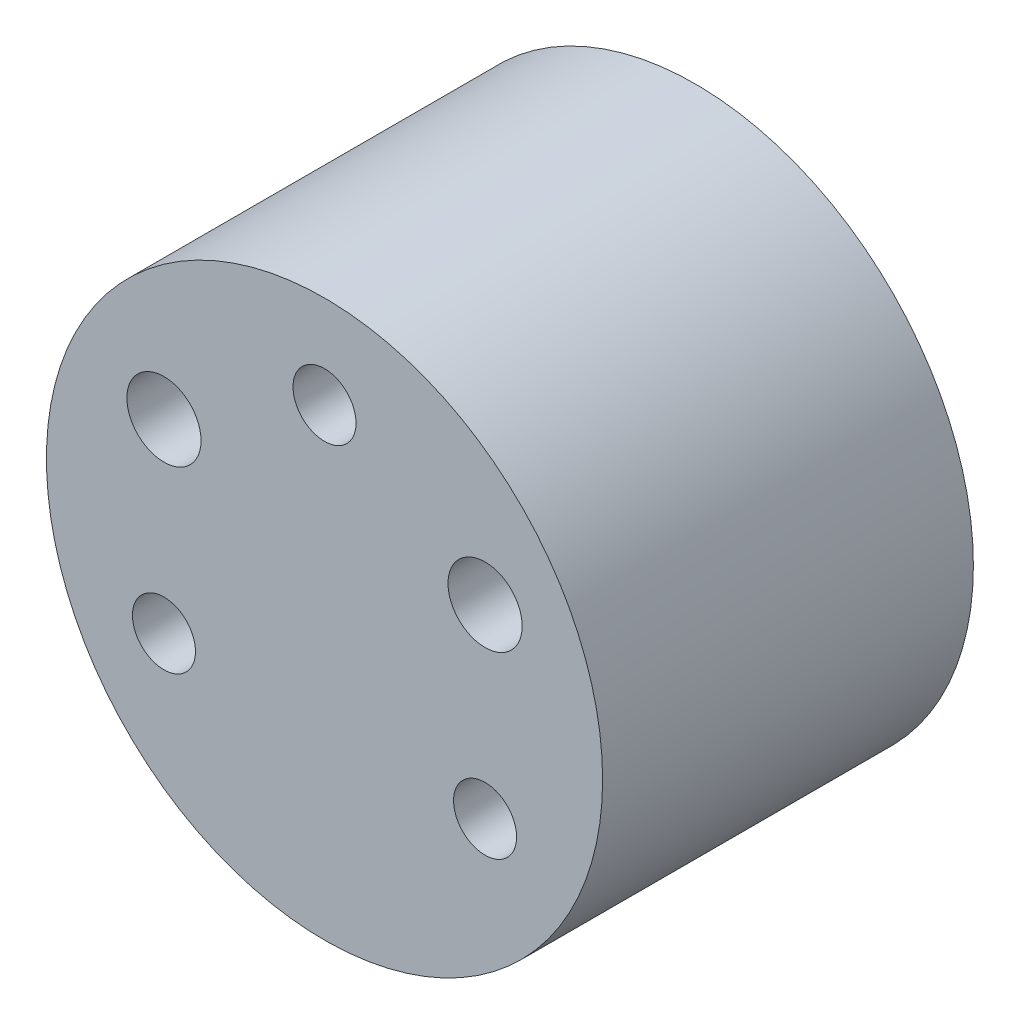
ISO-10303-21;
HEADER;
FILE_DESCRIPTION(('STEP AP214'),'2;1');
FILE_NAME('part.step','',(''),(''),'','','');
FILE_SCHEMA(('AUTOMOTIVE_DESIGN { 1 0 10303 214 1 1 1 1 }'));
ENDSEC;
DATA;
#1=APPLICATION_CONTEXT('core data for automotive mechanical design processes');
#2=APPLICATION_PROTOCOL_DEFINITION('international standard','automotive_design',2000,#1);
#3=PRODUCT_CONTEXT('',#1,'mechanical');
#4=PRODUCT('Part','Part','',(#3));
#5=PRODUCT_RELATED_PRODUCT_CATEGORY('part','',(#4));
#6=PRODUCT_DEFINITION_FORMATION('','',#4);
#7=PRODUCT_DEFINITION_CONTEXT('part definition',#1,'design');
#8=PRODUCT_DEFINITION('design','',#6,#7);
#9=PRODUCT_DEFINITION_SHAPE('','',#8);
#10=(LENGTH_UNIT() NAMED_UNIT(*) SI_UNIT(.MILLI.,.METRE.));
#11=(NAMED_UNIT(*) PLANE_ANGLE_UNIT() SI_UNIT($,.RADIAN.));
#12=(NAMED_UNIT(*) SI_UNIT($,.STERADIAN.) SOLID_ANGLE_UNIT());
#13=UNCERTAINTY_MEASURE_WITH_UNIT(LENGTH_MEASURE(1.E-05),#10,'distance_accuracy_value','');
#14=(GEOMETRIC_REPRESENTATION_CONTEXT(3) GLOBAL_UNCERTAINTY_ASSIGNED_CONTEXT((#13)) GLOBAL_UNIT_ASSIGNED_CONTEXT((#10,
#11,#12)) REPRESENTATION_CONTEXT('',''));
#15=CARTESIAN_POINT('',(0.,0.,0.));
#16=DIRECTION('',(0.,0.,1.));
#17=DIRECTION('',(1.,0.,0.));
#18=AXIS2_PLACEMENT_3D('',#15,#16,#17);
#19=CARTESIAN_POINT('',(0.,235.,40.));
#20=DIRECTION('',(0.,0.,-1.));
#21=DIRECTION('',(-1.,0.,0.));
#22=AXIS2_PLACEMENT_3D('',#19,#20,#21);
#23=CYLINDRICAL_SURFACE('',#22,30.);
#24=CARTESIAN_POINT('',(0.,235.,40.));
#25=DIRECTION('',(0.,0.,1.));
#26=DIRECTION('',(1.,0.,0.));
#27=AXIS2_PLACEMENT_3D('',#24,#25,#26);
#28=CIRCLE('',#27,30.);
#29=CARTESIAN_POINT('',(30.0000000000001,235.,40.));
#30=VERTEX_POINT('',#29);
#31=EDGE_CURVE('E11',#30,#30,#28,.T.);
#32=ORIENTED_EDGE('',*,*,#31,.F.);
#33=EDGE_LOOP('',(#32));
#34=FACE_BOUND('',#33,.T.);
#35=CARTESIAN_POINT('',(0.,235.,0.));
#36=DIRECTION('',(0.,0.,1.));
#37=DIRECTION('',(1.,0.,0.));
#38=AXIS2_PLACEMENT_3D('',#35,#36,#37);
#39=CIRCLE('',#38,30.);
#40=CARTESIAN_POINT('',(30.0000000000001,235.,0.));
#41=VERTEX_POINT('',#40);
#42=EDGE_CURVE('E41',#41,#41,#39,.T.);
#43=ORIENTED_EDGE('',*,*,#42,.T.);
#44=EDGE_LOOP('',(#43));
#45=FACE_BOUND('',#44,.T.);
#46=ADVANCED_FACE('F38',(#34,#45),#23,.T.);
#47=CARTESIAN_POINT('',(0.,235.,40.));
#48=DIRECTION('',(0.,0.,1.));
#49=DIRECTION('',(1.,0.,0.));
#50=AXIS2_PLACEMENT_3D('',#47,#48,#49);
#51=PLANE('',#50);
#52=CARTESIAN_POINT('',(17.3205080756888,245.,40.));
#53=DIRECTION('',(0.,0.,1.));
#54=DIRECTION('',(1.,0.,0.));
#55=AXIS2_PLACEMENT_3D('',#52,#53,#54);
#56=CIRCLE('',#55,4.);
#57=CARTESIAN_POINT('',(21.3205080756888,245.,40.));
#58=VERTEX_POINT('',#57);
#59=EDGE_CURVE('E72',#58,#58,#56,.T.);
#60=ORIENTED_EDGE('',*,*,#59,.F.);
#61=EDGE_LOOP('',(#60));
#62=FACE_BOUND('',#61,.T.);
#63=CARTESIAN_POINT('',(-17.3205080756887,245.,40.));
#64=DIRECTION('',(0.,0.,1.));
#65=DIRECTION('',(1.,0.,0.));
#66=AXIS2_PLACEMENT_3D('',#63,#64,#65);
#67=CIRCLE('',#66,4.);
#68=CARTESIAN_POINT('',(-13.3205080756887,245.,40.));
#69=VERTEX_POINT('',#68);
#70=EDGE_CURVE('E71',#69,#69,#67,.T.);
#71=ORIENTED_EDGE('',*,*,#70,.F.);
#72=EDGE_LOOP('',(#71));
#73=FACE_BOUND('',#72,.T.);
#74=CARTESIAN_POINT('',(-17.3205080756888,225.,40.));
#75=DIRECTION('',(0.,0.,1.));
#76=DIRECTION('',(1.,0.,0.));
#77=AXIS2_PLACEMENT_3D('',#74,#75,#76);
#78=CIRCLE('',#77,3.39999999999999);
#79=CARTESIAN_POINT('',(-13.9205080756888,225.,40.));
#80=VERTEX_POINT('',#79);
#81=EDGE_CURVE('E82',#80,#80,#78,.T.);
#82=ORIENTED_EDGE('',*,*,#81,.F.);
#83=EDGE_LOOP('',(#82));
#84=FACE_BOUND('',#83,.T.);
#85=CARTESIAN_POINT('',(0.,255.,40.));
#86=DIRECTION('',(0.,0.,1.));
#87=DIRECTION('',(1.,0.,0.));
#88=AXIS2_PLACEMENT_3D('',#85,#86,#87);
#89=CIRCLE('',#88,3.39999999999999);
#90=CARTESIAN_POINT('',(3.39999999999999,255.,40.));
#91=VERTEX_POINT('',#90);
#92=EDGE_CURVE('E88',#91,#91,#89,.T.);
#93=ORIENTED_EDGE('',*,*,#92,.F.);
#94=EDGE_LOOP('',(#93));
#95=FACE_BOUND('',#94,.T.);
#96=CARTESIAN_POINT('',(17.3205080756888,225.,40.));
#97=DIRECTION('',(0.,0.,1.));
#98=DIRECTION('',(1.,0.,0.));
#99=AXIS2_PLACEMENT_3D('',#96,#97,#98);
#100=CIRCLE('',#99,3.39999999999999);
#101=CARTESIAN_POINT('',(20.7205080756888,225.,40.));
#102=VERTEX_POINT('',#101);
#103=EDGE_CURVE('E94',#102,#102,#100,.T.);
#104=ORIENTED_EDGE('',*,*,#103,.F.);
#105=EDGE_LOOP('',(#104));
#106=FACE_BOUND('',#105,.T.);
#107=ORIENTED_EDGE('',*,*,#31,.T.);
#108=EDGE_LOOP('',(#107));
#109=FACE_BOUND('',#108,.T.);
#110=ADVANCED_FACE('F108',(#62,#73,#84,#95,#106,#109),#51,.T.);
#111=CARTESIAN_POINT('',(0.,235.,0.));
#112=DIRECTION('',(0.,0.,1.));
#113=DIRECTION('',(1.,0.,0.));
#114=AXIS2_PLACEMENT_3D('',#111,#112,#113);
#115=PLANE('',#114);
#116=ORIENTED_EDGE('',*,*,#42,.F.);
#117=EDGE_LOOP('',(#116));
#118=FACE_BOUND('',#117,.T.);
#119=ADVANCED_FACE('F105',(#118),#115,.F.);
#120=CARTESIAN_POINT('',(17.3205080756888,225.,10.));
#121=DIRECTION('',(0.,0.,1.));
#122=DIRECTION('',(1.,0.,0.));
#123=AXIS2_PLACEMENT_3D('',#120,#121,#122);
#124=CONICAL_SURFACE('',#123,3.39999999999999,1.02974425867665);
#125=CARTESIAN_POINT('',(17.3205080756888,225.,7.9570738953063));
#126=VERTEX_POINT('',#125);
#127=VERTEX_LOOP('',#126);
#128=FACE_BOUND('',#127,.T.);
#129=CARTESIAN_POINT('',(17.3205080756888,225.,10.));
#130=DIRECTION('',(0.,0.,1.));
#131=DIRECTION('',(1.,0.,0.));
#132=AXIS2_PLACEMENT_3D('',#129,#130,#131);
#133=CIRCLE('',#132,3.39999999999999);
#134=CARTESIAN_POINT('',(20.7205080756888,225.,10.));
#135=VERTEX_POINT('',#134);
#136=EDGE_CURVE('E97',#135,#135,#133,.T.);
#137=ORIENTED_EDGE('',*,*,#136,.T.);
#138=EDGE_LOOP('',(#137));
#139=FACE_BOUND('',#138,.T.);
#140=ADVANCED_FACE('F107',(#128,#139),#124,.F.);
#141=CARTESIAN_POINT('',(17.3205080756888,225.,40.));
#142=DIRECTION('',(0.,0.,1.));
#143=DIRECTION('',(1.,0.,0.));
#144=AXIS2_PLACEMENT_3D('',#141,#142,#143);
#145=CYLINDRICAL_SURFACE('',#144,3.39999999999999);
#146=ORIENTED_EDGE('',*,*,#136,.F.);
#147=EDGE_LOOP('',(#146));
#148=FACE_BOUND('',#147,.T.);
#149=ORIENTED_EDGE('',*,*,#103,.T.);
#150=EDGE_LOOP('',(#149));
#151=FACE_BOUND('',#150,.T.);
#152=ADVANCED_FACE('F113',(#148,#151),#145,.F.);
#153=CARTESIAN_POINT('',(0.,255.,10.));
#154=DIRECTION('',(0.,0.,1.));
#155=DIRECTION('',(1.,0.,0.));
#156=AXIS2_PLACEMENT_3D('',#153,#154,#155);
#157=CONICAL_SURFACE('',#156,3.39999999999999,1.02974425867665);
#158=CARTESIAN_POINT('',(0.,255.,7.9570738953063));
#159=VERTEX_POINT('',#158);
#160=VERTEX_LOOP('',#159);
#161=FACE_BOUND('',#160,.T.);
#162=CARTESIAN_POINT('',(0.,255.,10.));
#163=DIRECTION('',(0.,0.,1.));
#164=DIRECTION('',(1.,0.,0.));
#165=AXIS2_PLACEMENT_3D('',#162,#163,#164);
#166=CIRCLE('',#165,3.39999999999999);
#167=CARTESIAN_POINT('',(3.4,255.,10.));
#168=VERTEX_POINT('',#167);
#169=EDGE_CURVE('E91',#168,#168,#166,.T.);
#170=ORIENTED_EDGE('',*,*,#169,.T.);
#171=EDGE_LOOP('',(#170));
#172=FACE_BOUND('',#171,.T.);
#173=ADVANCED_FACE('F175',(#161,#172),#157,.F.);
#174=CARTESIAN_POINT('',(0.,255.,40.));
#175=DIRECTION('',(0.,0.,1.));
#176=DIRECTION('',(1.,0.,0.));
#177=AXIS2_PLACEMENT_3D('',#174,#175,#176);
#178=CYLINDRICAL_SURFACE('',#177,3.39999999999999);
#179=ORIENTED_EDGE('',*,*,#169,.F.);
#180=EDGE_LOOP('',(#179));
#181=FACE_BOUND('',#180,.T.);
#182=ORIENTED_EDGE('',*,*,#92,.T.);
#183=EDGE_LOOP('',(#182));
#184=FACE_BOUND('',#183,.T.);
#185=ADVANCED_FACE('F168',(#181,#184),#178,.F.);
#186=CARTESIAN_POINT('',(-17.3205080756888,225.,10.));
#187=DIRECTION('',(0.,0.,1.));
#188=DIRECTION('',(1.,0.,0.));
#189=AXIS2_PLACEMENT_3D('',#186,#187,#188);
#190=CONICAL_SURFACE('',#189,3.39999999999999,1.02974425867665);
#191=CARTESIAN_POINT('',(-17.3205080756888,225.,7.9570738953063));
#192=VERTEX_POINT('',#191);
#193=VERTEX_LOOP('',#192);
#194=FACE_BOUND('',#193,.T.);
#195=CARTESIAN_POINT('',(-17.3205080756888,225.,10.));
#196=DIRECTION('',(0.,0.,1.));
#197=DIRECTION('',(1.,0.,0.));
#198=AXIS2_PLACEMENT_3D('',#195,#196,#197);
#199=CIRCLE('',#198,3.39999999999999);
#200=CARTESIAN_POINT('',(-13.9205080756888,225.,10.));
#201=VERTEX_POINT('',#200);
#202=EDGE_CURVE('E85',#201,#201,#199,.T.);
#203=ORIENTED_EDGE('',*,*,#202,.T.);
#204=EDGE_LOOP('',(#203));
#205=FACE_BOUND('',#204,.T.);
#206=ADVANCED_FACE('F174',(#194,#205),#190,.F.);
#207=CARTESIAN_POINT('',(-17.3205080756888,225.,40.));
#208=DIRECTION('',(0.,0.,1.));
#209=DIRECTION('',(1.,0.,0.));
#210=AXIS2_PLACEMENT_3D('',#207,#208,#209);
#211=CYLINDRICAL_SURFACE('',#210,3.39999999999999);
#212=ORIENTED_EDGE('',*,*,#202,.F.);
#213=EDGE_LOOP('',(#212));
#214=FACE_BOUND('',#213,.T.);
#215=ORIENTED_EDGE('',*,*,#81,.T.);
#216=EDGE_LOOP('',(#215));
#217=FACE_BOUND('',#216,.T.);
#218=ADVANCED_FACE('F154',(#214,#217),#211,.F.);
#219=CARTESIAN_POINT('',(-17.3205080756887,245.,10.));
#220=DIRECTION('',(0.,0.,1.));
#221=DIRECTION('',(1.,0.,0.));
#222=AXIS2_PLACEMENT_3D('',#219,#220,#221);
#223=CONICAL_SURFACE('',#222,3.99999999999999,1.02974425867665);
#224=CARTESIAN_POINT('',(-17.3205080756887,245.,7.59655752388976));
#225=VERTEX_POINT('',#224);
#226=VERTEX_LOOP('',#225);
#227=FACE_BOUND('',#226,.T.);
#228=CARTESIAN_POINT('',(-17.3205080756887,245.,10.));
#229=DIRECTION('',(0.,0.,1.));
#230=DIRECTION('',(1.,0.,0.));
#231=AXIS2_PLACEMENT_3D('',#228,#229,#230);
#232=CIRCLE('',#231,3.99999999999999);
#233=CARTESIAN_POINT('',(-13.3205080756887,245.,10.));
#234=VERTEX_POINT('',#233);
#235=EDGE_CURVE('E75',#234,#234,#232,.T.);
#236=ORIENTED_EDGE('',*,*,#235,.T.);
#237=EDGE_LOOP('',(#236));
#238=FACE_BOUND('',#237,.T.);
#239=ADVANCED_FACE('F150',(#227,#238),#223,.F.);
#240=CARTESIAN_POINT('',(-17.3205080756887,245.,40.));
#241=DIRECTION('',(0.,0.,1.));
#242=DIRECTION('',(1.,0.,0.));
#243=AXIS2_PLACEMENT_3D('',#240,#241,#242);
#244=CYLINDRICAL_SURFACE('',#243,3.99999999999999);
#245=ORIENTED_EDGE('',*,*,#235,.F.);
#246=EDGE_LOOP('',(#245));
#247=FACE_BOUND('',#246,.T.);
#248=ORIENTED_EDGE('',*,*,#70,.T.);
#249=EDGE_LOOP('',(#248));
#250=FACE_BOUND('',#249,.T.);
#251=ADVANCED_FACE('F65',(#247,#250),#244,.F.);
#252=CARTESIAN_POINT('',(17.3205080756888,245.,10.));
#253=DIRECTION('',(0.,0.,1.));
#254=DIRECTION('',(1.,0.,0.));
#255=AXIS2_PLACEMENT_3D('',#252,#253,#254);
#256=CONICAL_SURFACE('',#255,3.99999999999999,1.02974425867665);
#257=CARTESIAN_POINT('',(17.3205080756888,245.,7.59655752388976));
#258=VERTEX_POINT('',#257);
#259=VERTEX_LOOP('',#258);
#260=FACE_BOUND('',#259,.T.);
#261=CARTESIAN_POINT('',(17.3205080756888,245.,10.));
#262=DIRECTION('',(0.,0.,1.));
#263=DIRECTION('',(1.,0.,0.));
#264=AXIS2_PLACEMENT_3D('',#261,#262,#263);
#265=CIRCLE('',#264,3.99999999999999);
#266=CARTESIAN_POINT('',(21.3205080756888,245.,10.));
#267=VERTEX_POINT('',#266);
#268=EDGE_CURVE('E69',#267,#267,#265,.T.);
#269=ORIENTED_EDGE('',*,*,#268,.T.);
#270=EDGE_LOOP('',(#269));
#271=FACE_BOUND('',#270,.T.);
#272=ADVANCED_FACE('F61',(#260,#271),#256,.F.);
#273=CARTESIAN_POINT('',(17.3205080756888,245.,40.));
#274=DIRECTION('',(0.,0.,1.));
#275=DIRECTION('',(1.,0.,0.));
#276=AXIS2_PLACEMENT_3D('',#273,#274,#275);
#277=CYLINDRICAL_SURFACE('',#276,3.99999999999999);
#278=ORIENTED_EDGE('',*,*,#268,.F.);
#279=EDGE_LOOP('',(#278));
#280=FACE_BOUND('',#279,.T.);
#281=ORIENTED_EDGE('',*,*,#59,.T.);
#282=EDGE_LOOP('',(#281));
#283=FACE_BOUND('',#282,.T.);
#284=ADVANCED_FACE('F64',(#280,#283),#277,.F.);
#285=CLOSED_SHELL('',(#46,#110,#119,#140,#152,#173,#185,#206,#218,#239,#251,#272,#284));
#286=MANIFOLD_SOLID_BREP('B2',#285);
#287=ADVANCED_BREP_SHAPE_REPRESENTATION('',(#18,#286),#14);
#288=SHAPE_DEFINITION_REPRESENTATION(#9,#287);
ENDSEC;
END-ISO-10303-21;
